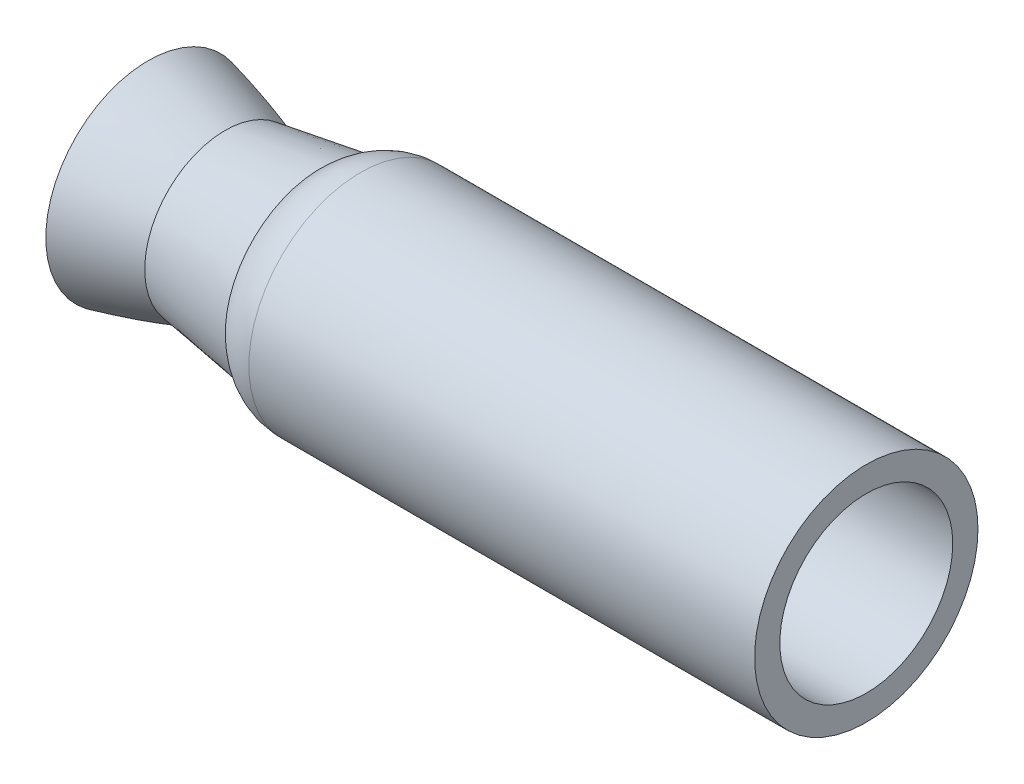
ISO-10303-21;
HEADER;
FILE_DESCRIPTION(('STEP AP214'),'2;1');
FILE_NAME('part.step','',(''),(''),'','','');
FILE_SCHEMA(('AUTOMOTIVE_DESIGN { 1 0 10303 214 1 1 1 1 }'));
ENDSEC;
DATA;
#1=APPLICATION_CONTEXT('core data for automotive mechanical design processes');
#2=APPLICATION_PROTOCOL_DEFINITION('international standard','automotive_design',2000,#1);
#3=PRODUCT_CONTEXT('',#1,'mechanical');
#4=PRODUCT('Part','Part','',(#3));
#5=PRODUCT_RELATED_PRODUCT_CATEGORY('part','',(#4));
#6=PRODUCT_DEFINITION_FORMATION('','',#4);
#7=PRODUCT_DEFINITION_CONTEXT('part definition',#1,'design');
#8=PRODUCT_DEFINITION('design','',#6,#7);
#9=PRODUCT_DEFINITION_SHAPE('','',#8);
#10=(LENGTH_UNIT() NAMED_UNIT(*) SI_UNIT(.MILLI.,.METRE.));
#11=(NAMED_UNIT(*) PLANE_ANGLE_UNIT() SI_UNIT($,.RADIAN.));
#12=(NAMED_UNIT(*) SI_UNIT($,.STERADIAN.) SOLID_ANGLE_UNIT());
#13=UNCERTAINTY_MEASURE_WITH_UNIT(LENGTH_MEASURE(1.E-05),#10,'distance_accuracy_value','');
#14=(GEOMETRIC_REPRESENTATION_CONTEXT(3) GLOBAL_UNCERTAINTY_ASSIGNED_CONTEXT((#13)) GLOBAL_UNIT_ASSIGNED_CONTEXT((#10,
#11,#12)) REPRESENTATION_CONTEXT('',''));
#15=CARTESIAN_POINT('',(0.,0.,0.));
#16=DIRECTION('',(0.,0.,1.));
#17=DIRECTION('',(1.,0.,0.));
#18=AXIS2_PLACEMENT_3D('',#15,#16,#17);
#19=CARTESIAN_POINT('',(16.2213148719435,0.,0.));
#20=DIRECTION('',(1.,0.,0.));
#21=DIRECTION('',(0.,0.,-1.));
#22=AXIS2_PLACEMENT_3D('',#19,#20,#21);
#23=CONICAL_SURFACE('',#22,30.1139260780084,0.153608941812711);
#24=CARTESIAN_POINT('',(-13.9815869319764,0.,0.));
#25=DIRECTION('',(1.,0.,0.));
#26=DIRECTION('',(0.,0.,-1.));
#27=AXIS2_PLACEMENT_3D('',#24,#25,#26);
#28=CIRCLE('',#27,25.4376523100107);
#29=CARTESIAN_POINT('',(-13.9815869319764,0.,-25.4376523100107));
#30=VERTEX_POINT('',#29);
#31=EDGE_CURVE('E10',#30,#30,#28,.T.);
#32=ORIENTED_EDGE('',*,*,#31,.T.);
#33=EDGE_LOOP('',(#32));
#34=FACE_BOUND('',#33,.T.);
#35=CARTESIAN_POINT('',(16.2213148719435,0.,0.));
#36=DIRECTION('',(1.,0.,0.));
#37=DIRECTION('',(0.,0.,-1.));
#38=AXIS2_PLACEMENT_3D('',#35,#36,#37);
#39=CIRCLE('',#38,30.1139260780084);
#40=CARTESIAN_POINT('',(16.2213148719435,0.,-30.1139260780084));
#41=VERTEX_POINT('',#40);
#42=EDGE_CURVE('E96',#41,#41,#39,.T.);
#43=ORIENTED_EDGE('',*,*,#42,.F.);
#44=EDGE_LOOP('',(#43));
#45=FACE_BOUND('',#44,.T.);
#46=ADVANCED_FACE('F45',(#34,#45),#23,.T.);
#47=CARTESIAN_POINT('',(2.34818467411676,19.2267693994655,0.));
#48=CARTESIAN_POINT('',(0.313545637149846,20.0775060384267,0.));
#49=CARTESIAN_POINT('',(-5.80027260825056,22.5182343123926,0.));
#50=CARTESIAN_POINT('',(-13.9783879935774,25.4749777740804,0.));
#51=CARTESIAN_POINT('',(-28.1601907707089,30.0701216730649,0.));
#52=CARTESIAN_POINT('',(-38.3150228285927,32.4320922392603,0.));
#53=B_SPLINE_CURVE_WITH_KNOTS('',2,(#47,#48,#49,#50,#51,#52),.UNSPECIFIED.,.F.,.F.,(3,1,1,1,3),
(0.0184938070279287,0.117487589461427,0.315475154328424,0.513462719195421,1.),.UNSPECIFIED.);
#54=CARTESIAN_POINT('',(0.,0.,0.));
#55=DIRECTION('',(1.,0.,0.));
#56=AXIS1_PLACEMENT('',#54,#55);
#57=SURFACE_OF_REVOLUTION('',#53,#56);
#58=CARTESIAN_POINT('',(-38.3150228285927,0.,0.));
#59=DIRECTION('',(1.,0.,0.));
#60=DIRECTION('',(0.,0.,-1.));
#61=AXIS2_PLACEMENT_3D('',#58,#59,#60);
#62=CIRCLE('',#61,32.4320922392603);
#63=CARTESIAN_POINT('',(-38.3150228285927,0.,-32.4320922392603));
#64=VERTEX_POINT('',#63);
#65=EDGE_CURVE('E52',#64,#64,#62,.T.);
#66=ORIENTED_EDGE('',*,*,#65,.T.);
#67=EDGE_LOOP('',(#66));
#68=FACE_BOUND('',#67,.T.);
#69=ORIENTED_EDGE('',*,*,#31,.F.);
#70=EDGE_LOOP('',(#69));
#71=FACE_BOUND('',#70,.T.);
#72=ADVANCED_FACE('F120',(#68,#71),#57,.F.);
#73=CARTESIAN_POINT('',(-40.1270102829806,0.,0.));
#74=DIRECTION('',(1.,0.,0.));
#75=DIRECTION('',(0.,0.,-1.));
#76=AXIS2_PLACEMENT_3D('',#73,#74,#75);
#77=CONICAL_SURFACE('',#76,24.64,1.34231515229828);
#78=ORIENTED_EDGE('',*,*,#65,.F.);
#79=EDGE_LOOP('',(#78));
#80=FACE_BOUND('',#79,.T.);
#81=CARTESIAN_POINT('',(-40.1270102829806,0.,0.));
#82=DIRECTION('',(1.,0.,0.));
#83=DIRECTION('',(0.,0.,-1.));
#84=AXIS2_PLACEMENT_3D('',#81,#82,#83);
#85=CIRCLE('',#84,24.64);
#86=CARTESIAN_POINT('',(-40.1270102829806,0.,-24.64));
#87=VERTEX_POINT('',#86);
#88=EDGE_CURVE('E57',#87,#87,#85,.T.);
#89=ORIENTED_EDGE('',*,*,#88,.T.);
#90=EDGE_LOOP('',(#89));
#91=FACE_BOUND('',#90,.T.);
#92=ADVANCED_FACE('F116',(#80,#91),#77,.T.);
#93=CARTESIAN_POINT('',(0.,11.5361374682942,0.));
#94=CARTESIAN_POINT('',(-19.9482573544596,19.9475956971547,0.));
#95=CARTESIAN_POINT('',(-40.1270102829806,24.64,0.));
#96=B_SPLINE_CURVE_WITH_KNOTS('',2,(#93,#94,#95),.UNSPECIFIED.,.F.,.F.,(3,3),(0.,1.),.UNSPECIFIED.);
#97=CARTESIAN_POINT('',(0.,0.,0.));
#98=DIRECTION('',(1.,0.,0.));
#99=AXIS1_PLACEMENT('',#97,#98);
#100=SURFACE_OF_REVOLUTION('',#96,#99);
#101=ORIENTED_EDGE('',*,*,#88,.F.);
#102=EDGE_LOOP('',(#101));
#103=FACE_BOUND('',#102,.T.);
#104=CARTESIAN_POINT('',(-8.33769055494808,0.,0.));
#105=DIRECTION('',(1.,0.,0.));
#106=DIRECTION('',(0.,0.,-1.));
#107=AXIS2_PLACEMENT_3D('',#104,#105,#106);
#108=CIRCLE('',#107,14.8855709050366);
#109=CARTESIAN_POINT('',(-8.33769055494808,0.,-14.8855709050366));
#110=VERTEX_POINT('',#109);
#111=EDGE_CURVE('E62',#110,#110,#108,.T.);
#112=ORIENTED_EDGE('',*,*,#111,.T.);
#113=EDGE_LOOP('',(#112));
#114=FACE_BOUND('',#113,.T.);
#115=ADVANCED_FACE('F111',(#103,#114),#100,.T.);
#116=CARTESIAN_POINT('',(-8.33769055494807,0.,0.));
#117=DIRECTION('',(1.,0.,0.));
#118=DIRECTION('',(0.,0.,-1.));
#119=AXIS2_PLACEMENT_3D('',#116,#117,#118);
#120=TOROIDAL_SURFACE('',#119,69.3610956139046,54.4755247088679);
#121=CARTESIAN_POINT('',(13.5417033689859,0.,0.));
#122=DIRECTION('',(1.,0.,0.));
#123=DIRECTION('',(0.,0.,-1.));
#124=AXIS2_PLACEMENT_3D('',#121,#122,#123);
#125=CIRCLE('',#124,19.4724705193221);
#126=CARTESIAN_POINT('',(13.5417033689859,0.,-19.4724705193221));
#127=VERTEX_POINT('',#126);
#128=EDGE_CURVE('E68',#127,#127,#125,.T.);
#129=ORIENTED_EDGE('',*,*,#128,.T.);
#130=EDGE_LOOP('',(#129));
#131=FACE_BOUND('',#130,.T.);
#132=ORIENTED_EDGE('',*,*,#111,.F.);
#133=EDGE_LOOP('',(#132));
#134=FACE_BOUND('',#133,.T.);
#135=ADVANCED_FACE('F115',(#131,#134),#120,.T.);
#136=CARTESIAN_POINT('',(-103.62375157043,0.,0.));
#137=DIRECTION('',(1.,0.,0.));
#138=DIRECTION('',(0.,0.,-1.));
#139=AXIS2_PLACEMENT_3D('',#136,#137,#138);
#140=DEGENERATE_TOROIDAL_SURFACE('',#139,286.62902320219,291.719672755462,.T.);
#141=ORIENTED_EDGE('',*,*,#128,.F.);
#142=EDGE_LOOP('',(#141));
#143=FACE_BOUND('',#142,.T.);
#144=CARTESIAN_POINT('',(19.6623094450522,0.,0.));
#145=DIRECTION('',(1.,0.,0.));
#146=DIRECTION('',(0.,0.,-1.));
#147=AXIS2_PLACEMENT_3D('',#144,#145,#146);
#148=CIRCLE('',#147,22.2412121521322);
#149=CARTESIAN_POINT('',(19.6623094450522,0.,-22.2412121521322));
#150=VERTEX_POINT('',#149);
#151=EDGE_CURVE('E72',#150,#150,#148,.T.);
#152=ORIENTED_EDGE('',*,*,#151,.T.);
#153=EDGE_LOOP('',(#152));
#154=FACE_BOUND('',#153,.T.);
#155=ADVANCED_FACE('F164',(#143,#154),#140,.T.);
#156=CARTESIAN_POINT('',(21.8781691214359,0.,0.));
#157=DIRECTION('',(1.,0.,0.));
#158=DIRECTION('',(0.,0.,-1.));
#159=AXIS2_PLACEMENT_3D('',#156,#157,#158);
#160=CONICAL_SURFACE('',#159,24.457071828516,0.785398163397458);
#161=ORIENTED_EDGE('',*,*,#151,.F.);
#162=EDGE_LOOP('',(#161));
#163=FACE_BOUND('',#162,.T.);
#164=CARTESIAN_POINT('',(21.8781691214359,0.,0.));
#165=DIRECTION('',(1.,0.,0.));
#166=DIRECTION('',(0.,0.,-1.));
#167=AXIS2_PLACEMENT_3D('',#164,#165,#166);
#168=CIRCLE('',#167,24.457071828516);
#169=CARTESIAN_POINT('',(21.8781691214359,0.,-24.457071828516));
#170=VERTEX_POINT('',#169);
#171=EDGE_CURVE('E76',#170,#170,#168,.T.);
#172=ORIENTED_EDGE('',*,*,#171,.T.);
#173=EDGE_LOOP('',(#172));
#174=FACE_BOUND('',#173,.T.);
#175=ADVANCED_FACE('F158',(#163,#174),#160,.F.);
#176=CARTESIAN_POINT('',(28.9492369333014,0.,0.));
#177=DIRECTION('',(1.,0.,0.));
#178=DIRECTION('',(0.,0.,-1.));
#179=AXIS2_PLACEMENT_3D('',#176,#177,#178);
#180=TOROIDAL_SURFACE('',#179,17.3860040166505,10.);
#181=ORIENTED_EDGE('',*,*,#171,.F.);
#182=EDGE_LOOP('',(#181));
#183=FACE_BOUND('',#182,.T.);
#184=CARTESIAN_POINT('',(28.9492369333014,0.,0.));
#185=DIRECTION('',(1.,0.,0.));
#186=DIRECTION('',(0.,0.,-1.));
#187=AXIS2_PLACEMENT_3D('',#184,#185,#186);
#188=CIRCLE('',#187,27.3860040166505);
#189=CARTESIAN_POINT('',(28.9492369333014,0.,-27.3860040166505));
#190=VERTEX_POINT('',#189);
#191=EDGE_CURVE('E80',#190,#190,#188,.T.);
#192=ORIENTED_EDGE('',*,*,#191,.T.);
#193=EDGE_LOOP('',(#192));
#194=FACE_BOUND('',#193,.T.);
#195=ADVANCED_FACE('F152',(#183,#194),#180,.F.);
#196=CARTESIAN_POINT('',(0.,0.,0.));
#197=DIRECTION('',(1.,0.,0.));
#198=DIRECTION('',(0.,0.,-1.));
#199=AXIS2_PLACEMENT_3D('',#196,#197,#198);
#200=CYLINDRICAL_SURFACE('',#199,27.3860040166505);
#201=ORIENTED_EDGE('',*,*,#191,.F.);
#202=EDGE_LOOP('',(#201));
#203=FACE_BOUND('',#202,.T.);
#204=CARTESIAN_POINT('',(189.133015330605,0.,0.));
#205=DIRECTION('',(1.,0.,0.));
#206=DIRECTION('',(0.,0.,-1.));
#207=AXIS2_PLACEMENT_3D('',#204,#205,#206);
#208=CIRCLE('',#207,27.3860040166505);
#209=CARTESIAN_POINT('',(189.133015330605,0.,-27.3860040166505));
#210=VERTEX_POINT('',#209);
#211=EDGE_CURVE('E84',#210,#210,#208,.T.);
#212=ORIENTED_EDGE('',*,*,#211,.T.);
#213=EDGE_LOOP('',(#212));
#214=FACE_BOUND('',#213,.T.);
#215=ADVANCED_FACE('F147',(#203,#214),#200,.F.);
#216=CARTESIAN_POINT('',(189.133015330605,0.,0.));
#217=DIRECTION('',(1.,0.,0.));
#218=DIRECTION('',(0.,0.,-1.));
#219=AXIS2_PLACEMENT_3D('',#216,#217,#218);
#220=PLANE('',#219);
#221=CARTESIAN_POINT('',(189.133015330605,0.,0.));
#222=DIRECTION('',(1.,0.,0.));
#223=DIRECTION('',(0.,0.,-1.));
#224=AXIS2_PLACEMENT_3D('',#221,#222,#223);
#225=CIRCLE('',#224,35.3860040166505);
#226=CARTESIAN_POINT('',(189.133015330605,0.,-35.3860040166505));
#227=VERTEX_POINT('',#226);
#228=EDGE_CURVE('E88',#227,#227,#225,.T.);
#229=ORIENTED_EDGE('',*,*,#228,.T.);
#230=EDGE_LOOP('',(#229));
#231=FACE_BOUND('',#230,.T.);
#232=ORIENTED_EDGE('',*,*,#211,.F.);
#233=EDGE_LOOP('',(#232));
#234=FACE_BOUND('',#233,.T.);
#235=ADVANCED_FACE('F141',(#231,#234),#220,.T.);
#236=CARTESIAN_POINT('',(0.,0.,0.));
#237=DIRECTION('',(1.,0.,0.));
#238=DIRECTION('',(0.,0.,-1.));
#239=AXIS2_PLACEMENT_3D('',#236,#237,#238);
#240=CYLINDRICAL_SURFACE('',#239,35.3860040166505);
#241=CARTESIAN_POINT('',(28.9492369333014,0.,0.));
#242=DIRECTION('',(1.,0.,0.));
#243=DIRECTION('',(0.,0.,-1.));
#244=AXIS2_PLACEMENT_3D('',#241,#242,#243);
#245=CIRCLE('',#244,35.3860040166505);
#246=CARTESIAN_POINT('',(28.9492369333014,0.,-35.3860040166505));
#247=VERTEX_POINT('',#246);
#248=EDGE_CURVE('E92',#247,#247,#245,.T.);
#249=ORIENTED_EDGE('',*,*,#248,.T.);
#250=EDGE_LOOP('',(#249));
#251=FACE_BOUND('',#250,.T.);
#252=ORIENTED_EDGE('',*,*,#228,.F.);
#253=EDGE_LOOP('',(#252));
#254=FACE_BOUND('',#253,.T.);
#255=ADVANCED_FACE('F135',(#251,#254),#240,.T.);
#256=CARTESIAN_POINT('',(28.9492369333014,0.,0.));
#257=DIRECTION('',(1.,0.,0.));
#258=DIRECTION('',(0.,0.,-1.));
#259=AXIS2_PLACEMENT_3D('',#256,#257,#258);
#260=DEGENERATE_TOROIDAL_SURFACE('',#259,17.3860040166505,18.,.T.);
#261=ORIENTED_EDGE('',*,*,#42,.T.);
#262=EDGE_LOOP('',(#261));
#263=FACE_BOUND('',#262,.T.);
#264=ORIENTED_EDGE('',*,*,#248,.F.);
#265=EDGE_LOOP('',(#264));
#266=FACE_BOUND('',#265,.T.);
#267=ADVANCED_FACE('F132',(#263,#266),#260,.T.);
#268=CLOSED_SHELL('',(#46,#72,#92,#115,#135,#155,#175,#195,#215,#235,#255,#267));
#269=MANIFOLD_SOLID_BREP('B2',#268);
#270=ADVANCED_BREP_SHAPE_REPRESENTATION('',(#18,#269),#14);
#271=SHAPE_DEFINITION_REPRESENTATION(#9,#270);
ENDSEC;
END-ISO-10303-21;
